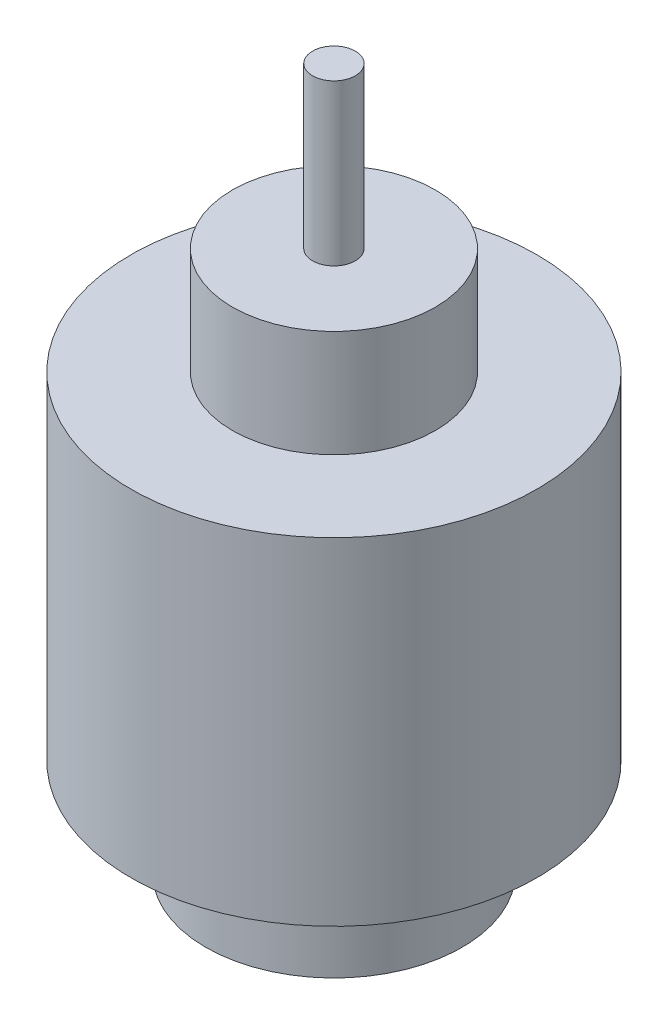
ISO-10303-21;
HEADER;
FILE_DESCRIPTION(('STEP AP214'),'2;1');
FILE_NAME('part.step','',(''),(''),'','','');
FILE_SCHEMA(('AUTOMOTIVE_DESIGN { 1 0 10303 214 1 1 1 1 }'));
ENDSEC;
DATA;
#1=APPLICATION_CONTEXT('core data for automotive mechanical design processes');
#2=APPLICATION_PROTOCOL_DEFINITION('international standard','automotive_design',2000,#1);
#3=PRODUCT_CONTEXT('',#1,'mechanical');
#4=PRODUCT('Part','Part','',(#3));
#5=PRODUCT_RELATED_PRODUCT_CATEGORY('part','',(#4));
#6=PRODUCT_DEFINITION_FORMATION('','',#4);
#7=PRODUCT_DEFINITION_CONTEXT('part definition',#1,'design');
#8=PRODUCT_DEFINITION('design','',#6,#7);
#9=PRODUCT_DEFINITION_SHAPE('','',#8);
#10=(LENGTH_UNIT() NAMED_UNIT(*) SI_UNIT(.MILLI.,.METRE.));
#11=(NAMED_UNIT(*) PLANE_ANGLE_UNIT() SI_UNIT($,.RADIAN.));
#12=(NAMED_UNIT(*) SI_UNIT($,.STERADIAN.) SOLID_ANGLE_UNIT());
#13=UNCERTAINTY_MEASURE_WITH_UNIT(LENGTH_MEASURE(1.E-05),#10,'distance_accuracy_value','');
#14=(GEOMETRIC_REPRESENTATION_CONTEXT(3) GLOBAL_UNCERTAINTY_ASSIGNED_CONTEXT((#13)) GLOBAL_UNIT_ASSIGNED_CONTEXT((#10,
#11,#12)) REPRESENTATION_CONTEXT('',''));
#15=CARTESIAN_POINT('',(0.,0.,0.));
#16=DIRECTION('',(0.,0.,1.));
#17=DIRECTION('',(1.,0.,0.));
#18=AXIS2_PLACEMENT_3D('',#15,#16,#17);
#19=CARTESIAN_POINT('',(3.48409299727513,0.,0.));
#20=DIRECTION('',(0.,-1.,0.));
#21=DIRECTION('',(0.,0.,-1.));
#22=AXIS2_PLACEMENT_3D('',#19,#20,#21);
#23=PLANE('',#22);
#24=CARTESIAN_POINT('',(0.,0.,0.));
#25=DIRECTION('',(0.,-1.,0.));
#26=DIRECTION('',(0.,0.,-1.));
#27=AXIS2_PLACEMENT_3D('',#24,#25,#26);
#28=CIRCLE('',#27,3.48409299727513);
#29=CARTESIAN_POINT('',(0.,0.,-3.48409299727513));
#30=VERTEX_POINT('',#29);
#31=EDGE_CURVE('E65',#30,#30,#28,.T.);
#32=ORIENTED_EDGE('',*,*,#31,.T.);
#33=EDGE_LOOP('',(#32));
#34=FACE_BOUND('',#33,.T.);
#35=ADVANCED_FACE('F31',(#34),#23,.T.);
#36=CARTESIAN_POINT('',(0.,70.,0.));
#37=DIRECTION('',(0.,1.,0.));
#38=DIRECTION('',(0.,0.,1.));
#39=AXIS2_PLACEMENT_3D('',#36,#37,#38);
#40=PLANE('',#39);
#41=CARTESIAN_POINT('',(0.,70.,0.));
#42=DIRECTION('',(0.,-1.,0.));
#43=DIRECTION('',(0.,0.,-1.));
#44=AXIS2_PLACEMENT_3D('',#41,#42,#43);
#45=CIRCLE('',#44,2.);
#46=CARTESIAN_POINT('',(0.,70.,-2.));
#47=VERTEX_POINT('',#46);
#48=EDGE_CURVE('E10',#47,#47,#45,.T.);
#49=ORIENTED_EDGE('',*,*,#48,.F.);
#50=EDGE_LOOP('',(#49));
#51=FACE_BOUND('',#50,.T.);
#52=ADVANCED_FACE('F82',(#51),#40,.T.);
#53=CARTESIAN_POINT('',(0.,0.,0.));
#54=DIRECTION('',(0.,-1.,0.));
#55=DIRECTION('',(0.,0.,-1.));
#56=AXIS2_PLACEMENT_3D('',#53,#54,#55);
#57=CYLINDRICAL_SURFACE('',#56,2.);
#58=ORIENTED_EDGE('',*,*,#48,.T.);
#59=EDGE_LOOP('',(#58));
#60=FACE_BOUND('',#59,.T.);
#61=CARTESIAN_POINT('',(0.,55.,0.));
#62=DIRECTION('',(0.,-1.,0.));
#63=DIRECTION('',(0.,0.,-1.));
#64=AXIS2_PLACEMENT_3D('',#61,#62,#63);
#65=CIRCLE('',#64,2.);
#66=CARTESIAN_POINT('',(0.,55.,-2.));
#67=VERTEX_POINT('',#66);
#68=EDGE_CURVE('E37',#67,#67,#65,.T.);
#69=ORIENTED_EDGE('',*,*,#68,.F.);
#70=EDGE_LOOP('',(#69));
#71=FACE_BOUND('',#70,.T.);
#72=ADVANCED_FACE('F86',(#60,#71),#57,.T.);
#73=CARTESIAN_POINT('',(2.,55.,0.));
#74=DIRECTION('',(0.,1.,0.));
#75=DIRECTION('',(0.,0.,1.));
#76=AXIS2_PLACEMENT_3D('',#73,#74,#75);
#77=PLANE('',#76);
#78=ORIENTED_EDGE('',*,*,#68,.T.);
#79=EDGE_LOOP('',(#78));
#80=FACE_BOUND('',#79,.T.);
#81=CARTESIAN_POINT('',(0.,55.,0.));
#82=DIRECTION('',(0.,-1.,0.));
#83=DIRECTION('',(0.,0.,-1.));
#84=AXIS2_PLACEMENT_3D('',#81,#82,#83);
#85=CIRCLE('',#84,9.5);
#86=CARTESIAN_POINT('',(0.,55.,-9.5));
#87=VERTEX_POINT('',#86);
#88=EDGE_CURVE('E41',#87,#87,#85,.T.);
#89=ORIENTED_EDGE('',*,*,#88,.F.);
#90=EDGE_LOOP('',(#89));
#91=FACE_BOUND('',#90,.T.);
#92=ADVANCED_FACE('F91',(#80,#91),#77,.T.);
#93=CARTESIAN_POINT('',(0.,0.,0.));
#94=DIRECTION('',(0.,-1.,0.));
#95=DIRECTION('',(0.,0.,-1.));
#96=AXIS2_PLACEMENT_3D('',#93,#94,#95);
#97=CYLINDRICAL_SURFACE('',#96,9.5);
#98=ORIENTED_EDGE('',*,*,#88,.T.);
#99=EDGE_LOOP('',(#98));
#100=FACE_BOUND('',#99,.T.);
#101=CARTESIAN_POINT('',(0.,45.,0.));
#102=DIRECTION('',(0.,-1.,0.));
#103=DIRECTION('',(0.,0.,-1.));
#104=AXIS2_PLACEMENT_3D('',#101,#102,#103);
#105=CIRCLE('',#104,9.5);
#106=CARTESIAN_POINT('',(0.,45.,-9.5));
#107=VERTEX_POINT('',#106);
#108=EDGE_CURVE('E45',#107,#107,#105,.T.);
#109=ORIENTED_EDGE('',*,*,#108,.F.);
#110=EDGE_LOOP('',(#109));
#111=FACE_BOUND('',#110,.T.);
#112=ADVANCED_FACE('F96',(#100,#111),#97,.T.);
#113=CARTESIAN_POINT('',(9.5,45.,0.));
#114=DIRECTION('',(0.,1.,0.));
#115=DIRECTION('',(0.,0.,1.));
#116=AXIS2_PLACEMENT_3D('',#113,#114,#115);
#117=PLANE('',#116);
#118=ORIENTED_EDGE('',*,*,#108,.T.);
#119=EDGE_LOOP('',(#118));
#120=FACE_BOUND('',#119,.T.);
#121=CARTESIAN_POINT('',(0.,45.,0.));
#122=DIRECTION('',(0.,-1.,0.));
#123=DIRECTION('',(0.,0.,-1.));
#124=AXIS2_PLACEMENT_3D('',#121,#122,#123);
#125=CIRCLE('',#124,19.);
#126=CARTESIAN_POINT('',(0.,45.,-19.));
#127=VERTEX_POINT('',#126);
#128=EDGE_CURVE('E50',#127,#127,#125,.T.);
#129=ORIENTED_EDGE('',*,*,#128,.F.);
#130=EDGE_LOOP('',(#129));
#131=FACE_BOUND('',#130,.T.);
#132=ADVANCED_FACE('F99',(#120,#131),#117,.T.);
#133=CARTESIAN_POINT('',(0.,0.,0.));
#134=DIRECTION('',(0.,-1.,0.));
#135=DIRECTION('',(0.,0.,-1.));
#136=AXIS2_PLACEMENT_3D('',#133,#134,#135);
#137=CYLINDRICAL_SURFACE('',#136,19.);
#138=ORIENTED_EDGE('',*,*,#128,.T.);
#139=EDGE_LOOP('',(#138));
#140=FACE_BOUND('',#139,.T.);
#141=CARTESIAN_POINT('',(0.,13.5071646152361,0.));
#142=DIRECTION('',(0.,-1.,0.));
#143=DIRECTION('',(0.,0.,-1.));
#144=AXIS2_PLACEMENT_3D('',#141,#142,#143);
#145=CIRCLE('',#144,19.);
#146=CARTESIAN_POINT('',(0.,13.5071646152361,-19.));
#147=VERTEX_POINT('',#146);
#148=EDGE_CURVE('E53',#147,#147,#145,.T.);
#149=ORIENTED_EDGE('',*,*,#148,.F.);
#150=EDGE_LOOP('',(#149));
#151=FACE_BOUND('',#150,.T.);
#152=ADVANCED_FACE('F103',(#140,#151),#137,.T.);
#153=CARTESIAN_POINT('',(19.,13.5071646152361,0.));
#154=DIRECTION('',(0.,-1.,0.));
#155=DIRECTION('',(0.,0.,-1.));
#156=AXIS2_PLACEMENT_3D('',#153,#154,#155);
#157=PLANE('',#156);
#158=ORIENTED_EDGE('',*,*,#148,.T.);
#159=EDGE_LOOP('',(#158));
#160=FACE_BOUND('',#159,.T.);
#161=CARTESIAN_POINT('',(0.,13.5071646152361,0.));
#162=DIRECTION('',(0.,-1.,0.));
#163=DIRECTION('',(0.,0.,-1.));
#164=AXIS2_PLACEMENT_3D('',#161,#162,#163);
#165=CIRCLE('',#164,12.);
#166=CARTESIAN_POINT('',(0.,13.5071646152361,-12.));
#167=VERTEX_POINT('',#166);
#168=EDGE_CURVE('E56',#167,#167,#165,.T.);
#169=ORIENTED_EDGE('',*,*,#168,.F.);
#170=EDGE_LOOP('',(#169));
#171=FACE_BOUND('',#170,.T.);
#172=ADVANCED_FACE('F107',(#160,#171),#157,.T.);
#173=CARTESIAN_POINT('',(0.,0.,0.));
#174=DIRECTION('',(0.,-1.,0.));
#175=DIRECTION('',(0.,0.,-1.));
#176=AXIS2_PLACEMENT_3D('',#173,#174,#175);
#177=CYLINDRICAL_SURFACE('',#176,12.);
#178=ORIENTED_EDGE('',*,*,#168,.T.);
#179=EDGE_LOOP('',(#178));
#180=FACE_BOUND('',#179,.T.);
#181=CARTESIAN_POINT('',(0.,4.37063437637143,0.));
#182=DIRECTION('',(0.,-1.,0.));
#183=DIRECTION('',(0.,0.,-1.));
#184=AXIS2_PLACEMENT_3D('',#181,#182,#183);
#185=CIRCLE('',#184,12.);
#186=CARTESIAN_POINT('',(0.,4.37063437637143,-12.));
#187=VERTEX_POINT('',#186);
#188=EDGE_CURVE('E59',#187,#187,#185,.T.);
#189=ORIENTED_EDGE('',*,*,#188,.F.);
#190=EDGE_LOOP('',(#189));
#191=FACE_BOUND('',#190,.T.);
#192=ADVANCED_FACE('F78',(#180,#191),#177,.T.);
#193=CARTESIAN_POINT('',(12.,4.37063437637143,0.));
#194=DIRECTION('',(0.,-1.,0.));
#195=DIRECTION('',(0.,0.,-1.));
#196=AXIS2_PLACEMENT_3D('',#193,#194,#195);
#197=PLANE('',#196);
#198=ORIENTED_EDGE('',*,*,#188,.T.);
#199=EDGE_LOOP('',(#198));
#200=FACE_BOUND('',#199,.T.);
#201=CARTESIAN_POINT('',(0.,4.37063437637143,0.));
#202=DIRECTION('',(0.,-1.,0.));
#203=DIRECTION('',(0.,0.,-1.));
#204=AXIS2_PLACEMENT_3D('',#201,#202,#203);
#205=CIRCLE('',#204,3.48409299727513);
#206=CARTESIAN_POINT('',(0.,4.37063437637143,-3.48409299727513));
#207=VERTEX_POINT('',#206);
#208=EDGE_CURVE('E62',#207,#207,#205,.T.);
#209=ORIENTED_EDGE('',*,*,#208,.F.);
#210=EDGE_LOOP('',(#209));
#211=FACE_BOUND('',#210,.T.);
#212=ADVANCED_FACE('F72',(#200,#211),#197,.T.);
#213=CARTESIAN_POINT('',(0.,0.,0.));
#214=DIRECTION('',(0.,-1.,0.));
#215=DIRECTION('',(0.,0.,-1.));
#216=AXIS2_PLACEMENT_3D('',#213,#214,#215);
#217=CYLINDRICAL_SURFACE('',#216,3.48409299727513);
#218=ORIENTED_EDGE('',*,*,#208,.T.);
#219=EDGE_LOOP('',(#218));
#220=FACE_BOUND('',#219,.T.);
#221=ORIENTED_EDGE('',*,*,#31,.F.);
#222=EDGE_LOOP('',(#221));
#223=FACE_BOUND('',#222,.T.);
#224=ADVANCED_FACE('F70',(#220,#223),#217,.T.);
#225=CLOSED_SHELL('',(#35,#52,#72,#92,#112,#132,#152,#172,#192,#212,#224));
#226=MANIFOLD_SOLID_BREP('B2',#225);
#227=ADVANCED_BREP_SHAPE_REPRESENTATION('',(#18,#226),#14);
#228=SHAPE_DEFINITION_REPRESENTATION(#9,#227);
ENDSEC;
END-ISO-10303-21;
